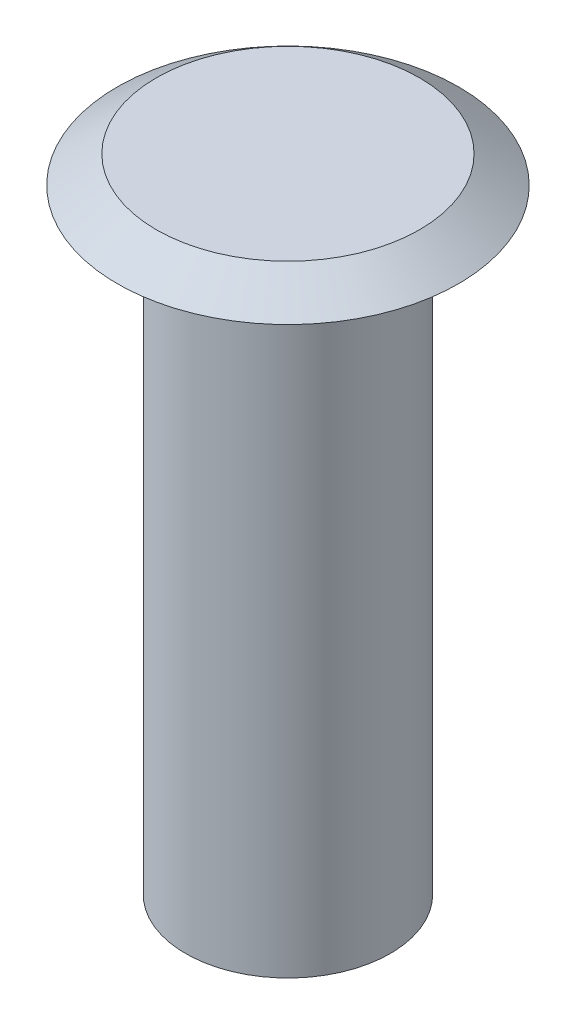
ISO-10303-21;
HEADER;
FILE_DESCRIPTION(('STEP AP214'),'2;1');
FILE_NAME('part.step','',(''),(''),'','','');
FILE_SCHEMA(('AUTOMOTIVE_DESIGN { 1 0 10303 214 1 1 1 1 }'));
ENDSEC;
DATA;
#1=APPLICATION_CONTEXT('core data for automotive mechanical design processes');
#2=APPLICATION_PROTOCOL_DEFINITION('international standard','automotive_design',2000,#1);
#3=PRODUCT_CONTEXT('',#1,'mechanical');
#4=PRODUCT('Part','Part','',(#3));
#5=PRODUCT_RELATED_PRODUCT_CATEGORY('part','',(#4));
#6=PRODUCT_DEFINITION_FORMATION('','',#4);
#7=PRODUCT_DEFINITION_CONTEXT('part definition',#1,'design');
#8=PRODUCT_DEFINITION('design','',#6,#7);
#9=PRODUCT_DEFINITION_SHAPE('','',#8);
#10=(LENGTH_UNIT() NAMED_UNIT(*) SI_UNIT(.MILLI.,.METRE.));
#11=(NAMED_UNIT(*) PLANE_ANGLE_UNIT() SI_UNIT($,.RADIAN.));
#12=(NAMED_UNIT(*) SI_UNIT($,.STERADIAN.) SOLID_ANGLE_UNIT());
#13=UNCERTAINTY_MEASURE_WITH_UNIT(LENGTH_MEASURE(1.E-05),#10,'distance_accuracy_value','');
#14=(GEOMETRIC_REPRESENTATION_CONTEXT(3) GLOBAL_UNCERTAINTY_ASSIGNED_CONTEXT((#13)) GLOBAL_UNIT_ASSIGNED_CONTEXT((#10,
#11,#12)) REPRESENTATION_CONTEXT('',''));
#15=CARTESIAN_POINT('',(0.,0.,0.));
#16=DIRECTION('',(0.,0.,1.));
#17=DIRECTION('',(1.,0.,0.));
#18=AXIS2_PLACEMENT_3D('',#15,#16,#17);
#19=CARTESIAN_POINT('',(0.,9.4,0.));
#20=DIRECTION('',(0.,-1.,0.));
#21=DIRECTION('',(0.,0.,-1.));
#22=AXIS2_PLACEMENT_3D('',#19,#20,#21);
#23=PLANE('',#22);
#24=CARTESIAN_POINT('',(0.,9.4,0.));
#25=DIRECTION('',(0.,-1.,0.));
#26=DIRECTION('',(0.,0.,-1.));
#27=AXIS2_PLACEMENT_3D('',#24,#25,#26);
#28=CIRCLE('',#27,1.92874079730315);
#29=CARTESIAN_POINT('',(0.,9.4,-1.92874079730315));
#30=VERTEX_POINT('',#29);
#31=EDGE_CURVE('E10',#30,#30,#28,.T.);
#32=ORIENTED_EDGE('',*,*,#31,.F.);
#33=EDGE_LOOP('',(#32));
#34=FACE_BOUND('',#33,.T.);
#35=ADVANCED_FACE('F39',(#34),#23,.F.);
#36=CARTESIAN_POINT('',(0.,9.4,0.));
#37=DIRECTION('',(0.,-1.,0.));
#38=DIRECTION('',(0.,0.,-1.));
#39=AXIS2_PLACEMENT_3D('',#36,#37,#38);
#40=CONICAL_SURFACE('',#39,1.92874079730315,0.959931088596885);
#41=CARTESIAN_POINT('',(0.,9.,0.));
#42=DIRECTION('',(0.,-1.,0.));
#43=DIRECTION('',(0.,0.,-1.));
#44=AXIS2_PLACEMENT_3D('',#41,#42,#43);
#45=CIRCLE('',#44,2.5);
#46=CARTESIAN_POINT('',(0.,9.,-2.5));
#47=VERTEX_POINT('',#46);
#48=EDGE_CURVE('E45',#47,#47,#45,.T.);
#49=ORIENTED_EDGE('',*,*,#48,.F.);
#50=EDGE_LOOP('',(#49));
#51=FACE_BOUND('',#50,.T.);
#52=ORIENTED_EDGE('',*,*,#31,.T.);
#53=EDGE_LOOP('',(#52));
#54=FACE_BOUND('',#53,.T.);
#55=ADVANCED_FACE('F87',(#51,#54),#40,.T.);
#56=CARTESIAN_POINT('',(-2.5,9.,0.));
#57=DIRECTION('',(0.,1.,0.));
#58=DIRECTION('',(0.,0.,1.));
#59=AXIS2_PLACEMENT_3D('',#56,#57,#58);
#60=PLANE('',#59);
#61=CARTESIAN_POINT('',(0.,9.,0.));
#62=DIRECTION('',(0.,-1.,0.));
#63=DIRECTION('',(0.,0.,-1.));
#64=AXIS2_PLACEMENT_3D('',#61,#62,#63);
#65=CIRCLE('',#64,1.5);
#66=CARTESIAN_POINT('',(0.,9.,-1.5));
#67=VERTEX_POINT('',#66);
#68=EDGE_CURVE('E49',#67,#67,#65,.T.);
#69=ORIENTED_EDGE('',*,*,#68,.F.);
#70=EDGE_LOOP('',(#69));
#71=FACE_BOUND('',#70,.T.);
#72=ORIENTED_EDGE('',*,*,#48,.T.);
#73=EDGE_LOOP('',(#72));
#74=FACE_BOUND('',#73,.T.);
#75=ADVANCED_FACE('F82',(#71,#74),#60,.F.);
#76=CARTESIAN_POINT('',(0.,0.,0.));
#77=DIRECTION('',(0.,-1.,0.));
#78=DIRECTION('',(0.,0.,-1.));
#79=AXIS2_PLACEMENT_3D('',#76,#77,#78);
#80=CYLINDRICAL_SURFACE('',#79,1.5);
#81=CARTESIAN_POINT('',(0.,0.,0.));
#82=DIRECTION('',(0.,-1.,0.));
#83=DIRECTION('',(0.,0.,-1.));
#84=AXIS2_PLACEMENT_3D('',#81,#82,#83);
#85=CIRCLE('',#84,1.5);
#86=CARTESIAN_POINT('',(0.,0.,-1.5));
#87=VERTEX_POINT('',#86);
#88=EDGE_CURVE('E53',#87,#87,#85,.T.);
#89=ORIENTED_EDGE('',*,*,#88,.F.);
#90=EDGE_LOOP('',(#89));
#91=FACE_BOUND('',#90,.T.);
#92=ORIENTED_EDGE('',*,*,#68,.T.);
#93=EDGE_LOOP('',(#92));
#94=FACE_BOUND('',#93,.T.);
#95=ADVANCED_FACE('F76',(#91,#94),#80,.T.);
#96=CARTESIAN_POINT('',(-1.5,0.,0.));
#97=DIRECTION('',(0.,1.,0.));
#98=DIRECTION('',(0.,0.,1.));
#99=AXIS2_PLACEMENT_3D('',#96,#97,#98);
#100=PLANE('',#99);
#101=CARTESIAN_POINT('',(0.,0.,0.));
#102=DIRECTION('',(0.,-1.,0.));
#103=DIRECTION('',(0.,0.,-1.));
#104=AXIS2_PLACEMENT_3D('',#101,#102,#103);
#105=CIRCLE('',#104,0.6);
#106=CARTESIAN_POINT('',(0.,0.,-0.6));
#107=VERTEX_POINT('',#106);
#108=EDGE_CURVE('E58',#107,#107,#105,.T.);
#109=ORIENTED_EDGE('',*,*,#108,.F.);
#110=EDGE_LOOP('',(#109));
#111=FACE_BOUND('',#110,.T.);
#112=ORIENTED_EDGE('',*,*,#88,.T.);
#113=EDGE_LOOP('',(#112));
#114=FACE_BOUND('',#113,.T.);
#115=ADVANCED_FACE('F70',(#111,#114),#100,.F.);
#116=CARTESIAN_POINT('',(0.,0.,0.));
#117=DIRECTION('',(0.,-1.,0.));
#118=DIRECTION('',(0.,0.,-1.));
#119=AXIS2_PLACEMENT_3D('',#116,#117,#118);
#120=CYLINDRICAL_SURFACE('',#119,0.6);
#121=CARTESIAN_POINT('',(0.,4.,0.));
#122=DIRECTION('',(0.,-1.,0.));
#123=DIRECTION('',(0.,0.,-1.));
#124=AXIS2_PLACEMENT_3D('',#121,#122,#123);
#125=CIRCLE('',#124,0.6);
#126=CARTESIAN_POINT('',(0.,4.,-0.6));
#127=VERTEX_POINT('',#126);
#128=EDGE_CURVE('E61',#127,#127,#125,.T.);
#129=ORIENTED_EDGE('',*,*,#128,.F.);
#130=EDGE_LOOP('',(#129));
#131=FACE_BOUND('',#130,.T.);
#132=ORIENTED_EDGE('',*,*,#108,.T.);
#133=EDGE_LOOP('',(#132));
#134=FACE_BOUND('',#133,.T.);
#135=ADVANCED_FACE('F67',(#131,#134),#120,.F.);
#136=CARTESIAN_POINT('',(-0.6,4.,0.));
#137=DIRECTION('',(0.,1.,0.));
#138=DIRECTION('',(0.,0.,1.));
#139=AXIS2_PLACEMENT_3D('',#136,#137,#138);
#140=PLANE('',#139);
#141=ORIENTED_EDGE('',*,*,#128,.T.);
#142=EDGE_LOOP('',(#141));
#143=FACE_BOUND('',#142,.T.);
#144=ADVANCED_FACE('F65',(#143),#140,.F.);
#145=CLOSED_SHELL('',(#35,#55,#75,#95,#115,#135,#144));
#146=MANIFOLD_SOLID_BREP('B2',#145);
#147=ADVANCED_BREP_SHAPE_REPRESENTATION('',(#18,#146),#14);
#148=SHAPE_DEFINITION_REPRESENTATION(#9,#147);
ENDSEC;
END-ISO-10303-21;
